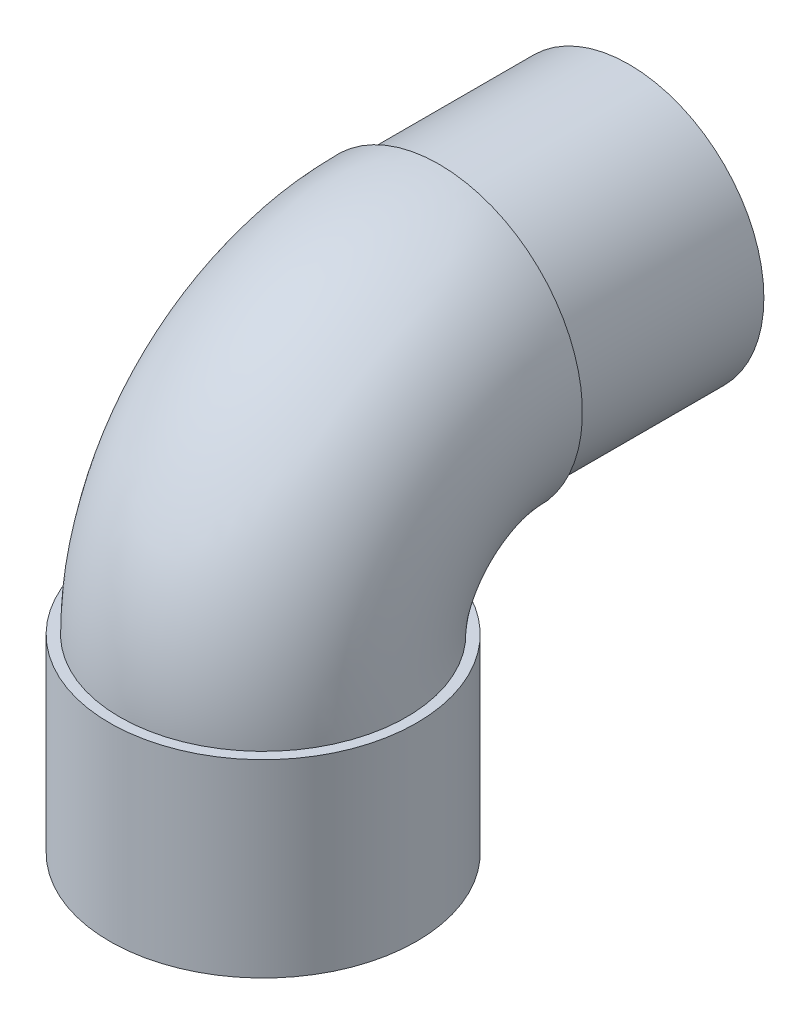
ISO-10303-21;
HEADER;
FILE_DESCRIPTION(('STEP AP214'),'2;1');
FILE_NAME('part.step','',(''),(''),'','','');
FILE_SCHEMA(('AUTOMOTIVE_DESIGN { 1 0 10303 214 1 1 1 1 }'));
ENDSEC;
DATA;
#1=APPLICATION_CONTEXT('core data for automotive mechanical design processes');
#2=APPLICATION_PROTOCOL_DEFINITION('international standard','automotive_design',2000,#1);
#3=PRODUCT_CONTEXT('',#1,'mechanical');
#4=PRODUCT('Part','Part','',(#3));
#5=PRODUCT_RELATED_PRODUCT_CATEGORY('part','',(#4));
#6=PRODUCT_DEFINITION_FORMATION('','',#4);
#7=PRODUCT_DEFINITION_CONTEXT('part definition',#1,'design');
#8=PRODUCT_DEFINITION('design','',#6,#7);
#9=PRODUCT_DEFINITION_SHAPE('','',#8);
#10=(LENGTH_UNIT() NAMED_UNIT(*) SI_UNIT(.MILLI.,.METRE.));
#11=(NAMED_UNIT(*) PLANE_ANGLE_UNIT() SI_UNIT($,.RADIAN.));
#12=(NAMED_UNIT(*) SI_UNIT($,.STERADIAN.) SOLID_ANGLE_UNIT());
#13=UNCERTAINTY_MEASURE_WITH_UNIT(LENGTH_MEASURE(1.E-05),#10,'distance_accuracy_value','');
#14=(GEOMETRIC_REPRESENTATION_CONTEXT(3) GLOBAL_UNCERTAINTY_ASSIGNED_CONTEXT((#13)) GLOBAL_UNIT_ASSIGNED_CONTEXT((#10,
#11,#12)) REPRESENTATION_CONTEXT('',''));
#15=CARTESIAN_POINT('',(0.,0.,0.));
#16=DIRECTION('',(0.,0.,1.));
#17=DIRECTION('',(1.,0.,0.));
#18=AXIS2_PLACEMENT_3D('',#15,#16,#17);
#19=CARTESIAN_POINT('',(0.,-20.7452819332567,20.7452819332566));
#20=DIRECTION('',(0.,-1.,0.));
#21=DIRECTION('',(1.,0.,0.));
#22=AXIS2_PLACEMENT_3D('',#19,#20,#21);
#23=PLANE('',#22);
#24=CARTESIAN_POINT('',(0.,-20.7452819332567,20.7452819332566));
#25=DIRECTION('',(0.,-1.,0.));
#26=DIRECTION('',(1.,0.,0.));
#27=AXIS2_PLACEMENT_3D('',#24,#25,#26);
#28=CIRCLE('',#27,13.9);
#29=CARTESIAN_POINT('',(0.,-20.7452819332568,34.6452819332566));
#30=VERTEX_POINT('',#29);
#31=EDGE_CURVE('E77',#30,#30,#28,.T.);
#32=ORIENTED_EDGE('',*,*,#31,.F.);
#33=EDGE_LOOP('',(#32));
#34=FACE_BOUND('',#33,.T.);
#35=CARTESIAN_POINT('',(0.,-20.7452819332567,20.7452819332566));
#36=DIRECTION('',(0.,-1.,0.));
#37=DIRECTION('',(0.,0.,-1.));
#38=AXIS2_PLACEMENT_3D('',#35,#36,#37);
#39=CIRCLE('',#38,16.1);
#40=CARTESIAN_POINT('',(0.,-20.7452819332566,4.64528193325663));
#41=VERTEX_POINT('',#40);
#42=EDGE_CURVE('E11',#41,#41,#39,.F.);
#43=ORIENTED_EDGE('',*,*,#42,.F.);
#44=EDGE_LOOP('',(#43));
#45=FACE_BOUND('',#44,.T.);
#46=ADVANCED_FACE('F49',(#34,#45),#23,.T.);
#47=CARTESIAN_POINT('',(0.,-20.7452819332566,0.));
#48=DIRECTION('',(-1.,0.,0.));
#49=DIRECTION('',(0.,0.,1.));
#50=AXIS2_PLACEMENT_3D('',#47,#48,#49);
#51=TOROIDAL_SURFACE('',#50,20.7452819332566,16.9);
#52=CARTESIAN_POINT('',(0.,-20.7452819332567,20.7452819332566));
#53=DIRECTION('',(0.,-1.,0.));
#54=DIRECTION('',(1.,0.,0.));
#55=AXIS2_PLACEMENT_3D('',#52,#53,#54);
#56=CIRCLE('',#55,16.9);
#57=CARTESIAN_POINT('',(0.,-20.7452819332568,37.6452819332566));
#58=VERTEX_POINT('',#57);
#59=EDGE_CURVE('E62',#58,#58,#56,.T.);
#60=CARTESIAN_POINT('',(0.,0.,0.));
#61=DIRECTION('',(0.,0.,1.));
#62=DIRECTION('',(1.,0.,0.));
#63=AXIS2_PLACEMENT_3D('',#60,#61,#62);
#64=CIRCLE('',#63,16.9);
#65=CARTESIAN_POINT('',(0.,16.9,0.));
#66=VERTEX_POINT('',#65);
#67=EDGE_CURVE('E68',#66,#66,#64,.T.);
#68=CARTESIAN_POINT('',(0.,-20.7452819332566,0.));
#69=DIRECTION('',(-1.,0.,0.));
#70=DIRECTION('',(0.,0.,1.));
#71=AXIS2_PLACEMENT_3D('',#68,#69,#70);
#72=CIRCLE('',#71,37.6452819332566);
#73=EDGE_CURVE('',#58,#66,#72,.T.);
#74=ORIENTED_EDGE('',*,*,#59,.F.);
#75=ORIENTED_EDGE('',*,*,#67,.T.);
#76=ORIENTED_EDGE('',*,*,#73,.T.);
#77=ORIENTED_EDGE('',*,*,#73,.F.);
#78=EDGE_LOOP('',(#74,#76,#75,#77));
#79=FACE_BOUND('',#78,.T.);
#80=ADVANCED_FACE('F51',(#79),#51,.T.);
#81=CARTESIAN_POINT('',(0.,0.,0.));
#82=DIRECTION('',(0.,0.,1.));
#83=DIRECTION('',(1.,0.,0.));
#84=AXIS2_PLACEMENT_3D('',#81,#82,#83);
#85=PLANE('',#84);
#86=CARTESIAN_POINT('',(0.,0.,0.));
#87=DIRECTION('',(0.,0.,-1.));
#88=DIRECTION('',(-1.,0.,0.));
#89=AXIS2_PLACEMENT_3D('',#86,#87,#88);
#90=CIRCLE('',#89,15.9);
#91=CARTESIAN_POINT('',(-15.9,0.,0.));
#92=VERTEX_POINT('',#91);
#93=EDGE_CURVE('E57',#92,#92,#90,.T.);
#94=ORIENTED_EDGE('',*,*,#93,.F.);
#95=EDGE_LOOP('',(#94));
#96=FACE_BOUND('',#95,.T.);
#97=ORIENTED_EDGE('',*,*,#67,.F.);
#98=EDGE_LOOP('',(#97));
#99=FACE_BOUND('',#98,.T.);
#100=ADVANCED_FACE('F86',(#96,#99),#85,.F.);
#101=CARTESIAN_POINT('',(0.,-20.7452819332566,0.));
#102=DIRECTION('',(-1.,0.,0.));
#103=DIRECTION('',(0.,0.,1.));
#104=AXIS2_PLACEMENT_3D('',#101,#102,#103);
#105=TOROIDAL_SURFACE('',#104,20.7452819332566,13.9);
#106=CARTESIAN_POINT('',(0.,0.,0.));
#107=DIRECTION('',(0.,0.,1.));
#108=DIRECTION('',(1.,0.,0.));
#109=AXIS2_PLACEMENT_3D('',#106,#107,#108);
#110=CIRCLE('',#109,13.9);
#111=CARTESIAN_POINT('',(0.,13.9,0.));
#112=VERTEX_POINT('',#111);
#113=EDGE_CURVE('E73',#112,#112,#110,.T.);
#114=CARTESIAN_POINT('',(0.,-20.7452819332566,0.));
#115=DIRECTION('',(-1.,0.,0.));
#116=DIRECTION('',(0.,0.,1.));
#117=AXIS2_PLACEMENT_3D('',#114,#115,#116);
#118=CIRCLE('',#117,34.6452819332566);
#119=EDGE_CURVE('',#30,#112,#118,.T.);
#120=ORIENTED_EDGE('',*,*,#31,.T.);
#121=ORIENTED_EDGE('',*,*,#113,.F.);
#122=ORIENTED_EDGE('',*,*,#119,.T.);
#123=ORIENTED_EDGE('',*,*,#119,.F.);
#124=EDGE_LOOP('',(#120,#122,#121,#123));
#125=FACE_BOUND('',#124,.T.);
#126=ADVANCED_FACE('F88',(#125),#105,.F.);
#127=CARTESIAN_POINT('',(0.,0.,-22.4));
#128=DIRECTION('',(0.,0.,-1.));
#129=DIRECTION('',(-1.,0.,0.));
#130=AXIS2_PLACEMENT_3D('',#127,#128,#129);
#131=PLANE('',#130);
#132=CARTESIAN_POINT('',(0.,0.,-22.4));
#133=DIRECTION('',(0.,0.,-1.));
#134=DIRECTION('',(-1.,0.,0.));
#135=AXIS2_PLACEMENT_3D('',#132,#133,#134);
#136=CIRCLE('',#135,15.9);
#137=CARTESIAN_POINT('',(-15.9,0.,-22.4));
#138=VERTEX_POINT('',#137);
#139=EDGE_CURVE('E71',#138,#138,#136,.T.);
#140=ORIENTED_EDGE('',*,*,#139,.T.);
#141=EDGE_LOOP('',(#140));
#142=FACE_BOUND('',#141,.T.);
#143=CARTESIAN_POINT('',(0.,0.,-22.4));
#144=DIRECTION('',(0.,0.,-1.));
#145=DIRECTION('',(-1.,0.,0.));
#146=AXIS2_PLACEMENT_3D('',#143,#144,#145);
#147=CIRCLE('',#146,13.9);
#148=CARTESIAN_POINT('',(-13.9,0.,-22.4));
#149=VERTEX_POINT('',#148);
#150=EDGE_CURVE('E136',#149,#149,#147,.T.);
#151=ORIENTED_EDGE('',*,*,#150,.F.);
#152=EDGE_LOOP('',(#151));
#153=FACE_BOUND('',#152,.T.);
#154=ADVANCED_FACE('F95',(#142,#153),#131,.T.);
#155=CARTESIAN_POINT('',(0.,0.,-22.4));
#156=DIRECTION('',(0.,0.,1.));
#157=DIRECTION('',(1.,0.,0.));
#158=AXIS2_PLACEMENT_3D('',#155,#156,#157);
#159=CYLINDRICAL_SURFACE('',#158,15.9);
#160=ORIENTED_EDGE('',*,*,#139,.F.);
#161=EDGE_LOOP('',(#160));
#162=FACE_BOUND('',#161,.T.);
#163=ORIENTED_EDGE('',*,*,#93,.T.);
#164=EDGE_LOOP('',(#163));
#165=FACE_BOUND('',#164,.T.);
#166=ADVANCED_FACE('F111',(#162,#165),#159,.T.);
#167=CARTESIAN_POINT('',(0.,0.,-22.4));
#168=DIRECTION('',(0.,0.,1.));
#169=DIRECTION('',(1.,0.,0.));
#170=AXIS2_PLACEMENT_3D('',#167,#168,#169);
#171=CYLINDRICAL_SURFACE('',#170,13.9);
#172=ORIENTED_EDGE('',*,*,#150,.T.);
#173=EDGE_LOOP('',(#172));
#174=FACE_BOUND('',#173,.T.);
#175=ORIENTED_EDGE('',*,*,#113,.T.);
#176=EDGE_LOOP('',(#175));
#177=FACE_BOUND('',#176,.T.);
#178=ADVANCED_FACE('F108',(#174,#177),#171,.F.);
#179=CARTESIAN_POINT('',(0.,-43.0452819332567,20.7452819332566));
#180=DIRECTION('',(0.,-1.,0.));
#181=DIRECTION('',(0.,0.,-1.));
#182=AXIS2_PLACEMENT_3D('',#179,#180,#181);
#183=PLANE('',#182);
#184=CARTESIAN_POINT('',(0.,-43.0452819332567,20.7452819332566));
#185=DIRECTION('',(0.,-1.,0.));
#186=DIRECTION('',(1.,0.,0.));
#187=AXIS2_PLACEMENT_3D('',#184,#185,#186);
#188=CIRCLE('',#187,18.1);
#189=CARTESIAN_POINT('',(18.1,-43.0452819332567,20.7452819332566));
#190=VERTEX_POINT('',#189);
#191=EDGE_CURVE('E138',#190,#190,#188,.T.);
#192=ORIENTED_EDGE('',*,*,#191,.T.);
#193=EDGE_LOOP('',(#192));
#194=FACE_BOUND('',#193,.T.);
#195=CARTESIAN_POINT('',(0.,-43.0452819332567,20.7452819332566));
#196=DIRECTION('',(0.,-1.,0.));
#197=DIRECTION('',(0.,0.,-1.));
#198=AXIS2_PLACEMENT_3D('',#195,#196,#197);
#199=CIRCLE('',#198,16.1);
#200=CARTESIAN_POINT('',(0.,-43.0452819332566,4.64528193325655));
#201=VERTEX_POINT('',#200);
#202=EDGE_CURVE('E147',#201,#201,#199,.T.);
#203=ORIENTED_EDGE('',*,*,#202,.F.);
#204=EDGE_LOOP('',(#203));
#205=FACE_BOUND('',#204,.T.);
#206=ADVANCED_FACE('F110',(#194,#205),#183,.T.);
#207=CARTESIAN_POINT('',(0.,-20.7452819332567,20.7452819332566));
#208=DIRECTION('',(0.,-1.,0.));
#209=DIRECTION('',(0.,0.,-1.));
#210=AXIS2_PLACEMENT_3D('',#207,#208,#209);
#211=PLANE('',#210);
#212=ORIENTED_EDGE('',*,*,#59,.T.);
#213=EDGE_LOOP('',(#212));
#214=FACE_BOUND('',#213,.T.);
#215=CARTESIAN_POINT('',(0.,-20.7452819332567,20.7452819332566));
#216=DIRECTION('',(0.,-1.,0.));
#217=DIRECTION('',(1.,0.,0.));
#218=AXIS2_PLACEMENT_3D('',#215,#216,#217);
#219=CIRCLE('',#218,18.1);
#220=CARTESIAN_POINT('',(18.1,-20.7452819332567,20.7452819332566));
#221=VERTEX_POINT('',#220);
#222=EDGE_CURVE('E142',#221,#221,#219,.T.);
#223=ORIENTED_EDGE('',*,*,#222,.F.);
#224=EDGE_LOOP('',(#223));
#225=FACE_BOUND('',#224,.T.);
#226=ADVANCED_FACE('F118',(#214,#225),#211,.F.);
#227=CARTESIAN_POINT('',(0.,-43.0452819332567,20.7452819332566));
#228=DIRECTION('',(0.,1.,0.));
#229=DIRECTION('',(0.,0.,1.));
#230=AXIS2_PLACEMENT_3D('',#227,#228,#229);
#231=CYLINDRICAL_SURFACE('',#230,18.1);
#232=ORIENTED_EDGE('',*,*,#191,.F.);
#233=EDGE_LOOP('',(#232));
#234=FACE_BOUND('',#233,.T.);
#235=ORIENTED_EDGE('',*,*,#222,.T.);
#236=EDGE_LOOP('',(#235));
#237=FACE_BOUND('',#236,.T.);
#238=ADVANCED_FACE('F126',(#234,#237),#231,.T.);
#239=CARTESIAN_POINT('',(0.,-43.0452819332567,20.7452819332566));
#240=DIRECTION('',(0.,1.,0.));
#241=DIRECTION('',(0.,0.,1.));
#242=AXIS2_PLACEMENT_3D('',#239,#240,#241);
#243=CYLINDRICAL_SURFACE('',#242,16.1);
#244=ORIENTED_EDGE('',*,*,#202,.T.);
#245=EDGE_LOOP('',(#244));
#246=FACE_BOUND('',#245,.T.);
#247=ORIENTED_EDGE('',*,*,#42,.T.);
#248=EDGE_LOOP('',(#247));
#249=FACE_BOUND('',#248,.T.);
#250=ADVANCED_FACE('F153',(#246,#249),#243,.F.);
#251=CLOSED_SHELL('',(#46,#80,#100,#126,#154,#166,#178,#206,#226,#238,#250));
#252=MANIFOLD_SOLID_BREP('B2',#251);
#253=ADVANCED_BREP_SHAPE_REPRESENTATION('',(#18,#252),#14);
#254=SHAPE_DEFINITION_REPRESENTATION(#9,#253);
ENDSEC;
END-ISO-10303-21;
